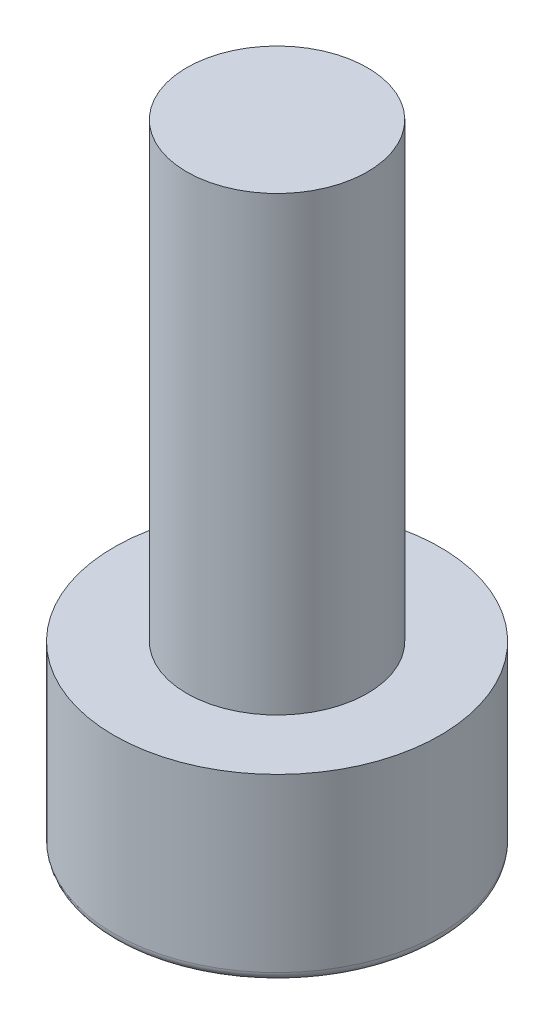
ISO-10303-21;
HEADER;
FILE_DESCRIPTION(('STEP AP214'),'2;1');
FILE_NAME('part.step','',(''),(''),'','','');
FILE_SCHEMA(('AUTOMOTIVE_DESIGN { 1 0 10303 214 1 1 1 1 }'));
ENDSEC;
DATA;
#1=APPLICATION_CONTEXT('core data for automotive mechanical design processes');
#2=APPLICATION_PROTOCOL_DEFINITION('international standard','automotive_design',2000,#1);
#3=PRODUCT_CONTEXT('',#1,'mechanical');
#4=PRODUCT('Part','Part','',(#3));
#5=PRODUCT_RELATED_PRODUCT_CATEGORY('part','',(#4));
#6=PRODUCT_DEFINITION_FORMATION('','',#4);
#7=PRODUCT_DEFINITION_CONTEXT('part definition',#1,'design');
#8=PRODUCT_DEFINITION('design','',#6,#7);
#9=PRODUCT_DEFINITION_SHAPE('','',#8);
#10=(LENGTH_UNIT() NAMED_UNIT(*) SI_UNIT(.MILLI.,.METRE.));
#11=(NAMED_UNIT(*) PLANE_ANGLE_UNIT() SI_UNIT($,.RADIAN.));
#12=(NAMED_UNIT(*) SI_UNIT($,.STERADIAN.) SOLID_ANGLE_UNIT());
#13=UNCERTAINTY_MEASURE_WITH_UNIT(LENGTH_MEASURE(1.E-05),#10,'distance_accuracy_value','');
#14=(GEOMETRIC_REPRESENTATION_CONTEXT(3) GLOBAL_UNCERTAINTY_ASSIGNED_CONTEXT((#13)) GLOBAL_UNIT_ASSIGNED_CONTEXT((#10,
#11,#12)) REPRESENTATION_CONTEXT('',''));
#15=CARTESIAN_POINT('',(0.,0.,0.));
#16=DIRECTION('',(0.,0.,1.));
#17=DIRECTION('',(1.,0.,0.));
#18=AXIS2_PLACEMENT_3D('',#15,#16,#17);
#19=CARTESIAN_POINT('',(4.801923715428,74.22799013228,211.8563655581));
#20=DIRECTION('',(0.,-1.,0.));
#21=DIRECTION('',(0.,0.,-1.));
#22=AXIS2_PLACEMENT_3D('',#19,#20,#21);
#23=PLANE('',#22);
#24=DIRECTION('',(0.,0.,-1.));
#25=VECTOR('',#24,1.);
#26=CARTESIAN_POINT('',(1.459131043565,74.22799013228,215.0364269651));
#27=LINE('',#26,#25);
#28=CARTESIAN_POINT('',(1.4591310435794,74.22799013228,213.097676699031));
#29=VERTEX_POINT('',#28);
#30=CARTESIAN_POINT('',(1.45913104356671,74.22799013228,214.841274511996));
#31=VERTEX_POINT('',#30);
#32=EDGE_CURVE('E84',#29,#31,#27,.F.);
#33=ORIENTED_EDGE('',*,*,#32,.F.);
#34=DIRECTION('',(0.866025403784429,0.,-0.500000000000017));
#35=VECTOR('',#34,1.);
#36=CARTESIAN_POINT('',(1.283533048647,74.22799013228,213.1990582487));
#37=LINE('',#36,#35);
#38=CARTESIAN_POINT('',(2.96913104358536,74.22799013228,212.225877792566));
#39=VERTEX_POINT('',#38);
#40=EDGE_CURVE('E68',#39,#29,#37,.F.);
#41=ORIENTED_EDGE('',*,*,#40,.F.);
#42=DIRECTION('',(0.866025403784429,0.,0.500000000000017));
#43=VECTOR('',#42,1.);
#44=CARTESIAN_POINT('',(2.793533048649,74.22799013228,212.1244962429));
#45=LINE('',#44,#43);
#46=CARTESIAN_POINT('',(4.47913104356371,74.22799013228,213.097676699003));
#47=VERTEX_POINT('',#46);
#48=EDGE_CURVE('E73',#47,#39,#45,.F.);
#49=ORIENTED_EDGE('',*,*,#48,.F.);
#50=DIRECTION('',(0.,0.,1.));
#51=VECTOR('',#50,1.);
#52=CARTESIAN_POINT('',(4.479131043565,74.22799013228,212.9025242459));
#53=LINE('',#52,#51);
#54=CARTESIAN_POINT('',(4.47913104357273,74.22799013228,214.841274512019));
#55=VERTEX_POINT('',#54);
#56=EDGE_CURVE('E125',#55,#47,#53,.F.);
#57=ORIENTED_EDGE('',*,*,#56,.F.);
#58=DIRECTION('',(-0.866025403784429,0.,0.500000000000017));
#59=VECTOR('',#58,1.);
#60=CARTESIAN_POINT('',(4.654729038483,74.22799013228,214.7398929624));
#61=LINE('',#60,#59);
#62=CARTESIAN_POINT('',(2.96913104358062,74.22799013228,215.713073418486));
#63=VERTEX_POINT('',#62);
#64=EDGE_CURVE('E128',#63,#55,#61,.F.);
#65=ORIENTED_EDGE('',*,*,#64,.F.);
#66=DIRECTION('',(-0.866025403784429,0.,-0.500000000000017));
#67=VECTOR('',#66,1.);
#68=CARTESIAN_POINT('',(3.144729038485,74.22799013228,215.8144549681));
#69=LINE('',#68,#67);
#70=EDGE_CURVE('E133',#31,#63,#69,.F.);
#71=ORIENTED_EDGE('',*,*,#70,.F.);
#72=EDGE_LOOP('',(#33,#41,#49,#57,#65,#71));
#73=FACE_BOUND('',#72,.T.);
#74=ADVANCED_FACE('F17',(#73),#23,.T.);
#75=CARTESIAN_POINT('',(2.793533048649,74.44878280414,212.1244962429));
#76=DIRECTION('',(-0.500000000000017,0.,0.866025403784429));
#77=DIRECTION('',(0.866025403784429,0.,0.500000000000017));
#78=AXIS2_PLACEMENT_3D('',#75,#76,#77);
#79=PLANE('',#78);
#80=ORIENTED_EDGE('',*,*,#48,.T.);
#81=DIRECTION('',(0.,1.,0.));
#82=VECTOR('',#81,1.);
#83=CARTESIAN_POINT('',(2.96913104358263,74.44878280414,212.225877792578));
#84=LINE('',#83,#82);
#85=CARTESIAN_POINT('',(2.96913104358711,72.22799013228,212.225877792563));
#86=VERTEX_POINT('',#85);
#87=EDGE_CURVE('E75',#86,#39,#84,.T.);
#88=ORIENTED_EDGE('',*,*,#87,.F.);
#89=DIRECTION('',(-0.866025403794045,0.,-0.499999999983361));
#90=VECTOR('',#89,1.);
#91=CARTESIAN_POINT('',(4.47913104356407,72.22799013228,213.097676699002));
#92=LINE('',#91,#90);
#93=CARTESIAN_POINT('',(4.47913104356474,72.22799013228,213.097676699006));
#94=VERTEX_POINT('',#93);
#95=EDGE_CURVE('E122',#94,#86,#92,.T.);
#96=ORIENTED_EDGE('',*,*,#95,.F.);
#97=DIRECTION('',(0.,1.,0.));
#98=VECTOR('',#97,1.);
#99=CARTESIAN_POINT('',(4.479131043565,74.44878280414,213.097676699002));
#100=LINE('',#99,#98);
#101=EDGE_CURVE('E78',#47,#94,#100,.F.);
#102=ORIENTED_EDGE('',*,*,#101,.F.);
#103=EDGE_LOOP('',(#80,#88,#96,#102));
#104=FACE_BOUND('',#103,.T.);
#105=ADVANCED_FACE('F74',(#104),#79,.T.);
#106=CARTESIAN_POINT('',(1.283533048647,74.44878280414,213.1990582487));
#107=DIRECTION('',(0.500000000000017,0.,0.866025403784429));
#108=DIRECTION('',(0.866025403784429,0.,-0.500000000000017));
#109=AXIS2_PLACEMENT_3D('',#106,#107,#108);
#110=PLANE('',#109);
#111=ORIENTED_EDGE('',*,*,#40,.T.);
#112=DIRECTION('',(0.,1.,0.));
#113=VECTOR('',#112,1.);
#114=CARTESIAN_POINT('',(1.459131043565,74.44878280414,213.097676699012));
#115=LINE('',#114,#113);
#116=CARTESIAN_POINT('',(1.45913104358081,72.22799013228,213.09767669903));
#117=VERTEX_POINT('',#116);
#118=EDGE_CURVE('E86',#117,#29,#115,.T.);
#119=ORIENTED_EDGE('',*,*,#118,.F.);
#120=DIRECTION('',(-0.866025403794834,0.,0.499999999981995));
#121=VECTOR('',#120,1.);
#122=CARTESIAN_POINT('',(2.96913104357969,72.22799013228,212.225877792573));
#123=LINE('',#122,#121);
#124=EDGE_CURVE('E90',#86,#117,#123,.T.);
#125=ORIENTED_EDGE('',*,*,#124,.F.);
#126=ORIENTED_EDGE('',*,*,#87,.T.);
#127=EDGE_LOOP('',(#111,#119,#125,#126));
#128=FACE_BOUND('',#127,.T.);
#129=ADVANCED_FACE('F88',(#128),#110,.T.);
#130=CARTESIAN_POINT('',(1.459131043565,74.44878280414,215.0364269651));
#131=DIRECTION('',(1.,0.,0.));
#132=DIRECTION('',(0.,0.,-1.));
#133=AXIS2_PLACEMENT_3D('',#130,#131,#132);
#134=PLANE('',#133);
#135=ORIENTED_EDGE('',*,*,#32,.T.);
#136=DIRECTION('',(0.,1.,0.));
#137=VECTOR('',#136,1.);
#138=CARTESIAN_POINT('',(1.45913104357047,74.44878280414,214.841274511991));
#139=LINE('',#138,#137);
#140=CARTESIAN_POINT('',(1.45913104356812,72.22799013228,214.841274511997));
#141=VERTEX_POINT('',#140);
#142=EDGE_CURVE('E135',#141,#31,#139,.T.);
#143=ORIENTED_EDGE('',*,*,#142,.F.);
#144=DIRECTION('',(0.,0.,-1.));
#145=VECTOR('',#144,1.);
#146=CARTESIAN_POINT('',(1.45913104357203,72.22799013228,218.0822682774));
#147=LINE('',#146,#145);
#148=EDGE_CURVE('E118',#117,#141,#147,.F.);
#149=ORIENTED_EDGE('',*,*,#148,.F.);
#150=ORIENTED_EDGE('',*,*,#118,.T.);
#151=EDGE_LOOP('',(#135,#143,#149,#150));
#152=FACE_BOUND('',#151,.T.);
#153=ADVANCED_FACE('F140',(#152),#134,.T.);
#154=CARTESIAN_POINT('',(3.144729038485,74.44878280414,215.8144549681));
#155=DIRECTION('',(0.500000000000017,0.,-0.866025403784429));
#156=DIRECTION('',(-0.866025403784429,0.,-0.500000000000017));
#157=AXIS2_PLACEMENT_3D('',#154,#155,#156);
#158=PLANE('',#157);
#159=ORIENTED_EDGE('',*,*,#70,.T.);
#160=DIRECTION('',(0.,1.,0.));
#161=VECTOR('',#160,1.);
#162=CARTESIAN_POINT('',(2.96913104358284,74.44878280414,215.713073418501));
#163=LINE('',#162,#161);
#164=CARTESIAN_POINT('',(2.96913104358157,72.22799013228,215.713073418485));
#165=VERTEX_POINT('',#164);
#166=EDGE_CURVE('E130',#165,#63,#163,.T.);
#167=ORIENTED_EDGE('',*,*,#166,.F.);
#168=DIRECTION('',(0.866025403782101,0.,0.500000000004048));
#169=VECTOR('',#168,1.);
#170=CARTESIAN_POINT('',(1.45913104356637,72.22799013228,214.841274511998));
#171=LINE('',#170,#169);
#172=EDGE_CURVE('E115',#141,#165,#171,.T.);
#173=ORIENTED_EDGE('',*,*,#172,.F.);
#174=ORIENTED_EDGE('',*,*,#142,.T.);
#175=EDGE_LOOP('',(#159,#167,#173,#174));
#176=FACE_BOUND('',#175,.T.);
#177=ADVANCED_FACE('F149',(#176),#158,.T.);
#178=CARTESIAN_POINT('',(4.654729038483,74.44878280414,214.7398929624));
#179=DIRECTION('',(-0.500000000000017,0.,-0.866025403784429));
#180=DIRECTION('',(-0.866025403784429,0.,0.500000000000017));
#181=AXIS2_PLACEMENT_3D('',#178,#179,#180);
#182=PLANE('',#181);
#183=ORIENTED_EDGE('',*,*,#64,.T.);
#184=DIRECTION('',(0.,1.,0.));
#185=VECTOR('',#184,1.);
#186=CARTESIAN_POINT('',(4.479131043565,74.44878280414,214.841274512013));
#187=LINE('',#186,#185);
#188=CARTESIAN_POINT('',(4.47913104357474,72.22799013228,214.84127451202));
#189=VERTEX_POINT('',#188);
#190=EDGE_CURVE('E36',#189,#55,#187,.T.);
#191=ORIENTED_EDGE('',*,*,#190,.F.);
#192=DIRECTION('',(0.866025403784169,0.,-0.500000000000467));
#193=VECTOR('',#192,1.);
#194=CARTESIAN_POINT('',(2.96913104357571,72.22799013228,215.713073418489));
#195=LINE('',#194,#193);
#196=EDGE_CURVE('E112',#165,#189,#195,.T.);
#197=ORIENTED_EDGE('',*,*,#196,.F.);
#198=ORIENTED_EDGE('',*,*,#166,.T.);
#199=EDGE_LOOP('',(#183,#191,#197,#198));
#200=FACE_BOUND('',#199,.T.);
#201=ADVANCED_FACE('F147',(#200),#182,.T.);
#202=CARTESIAN_POINT('',(4.479131043565,74.44878280414,212.9025242459));
#203=DIRECTION('',(-1.,0.,0.));
#204=DIRECTION('',(0.,0.,1.));
#205=AXIS2_PLACEMENT_3D('',#202,#203,#204);
#206=PLANE('',#205);
#207=ORIENTED_EDGE('',*,*,#56,.T.);
#208=ORIENTED_EDGE('',*,*,#101,.T.);
#209=DIRECTION('',(0.,0.,-1.));
#210=VECTOR('',#209,1.);
#211=CARTESIAN_POINT('',(4.47913104357259,72.22799013228,218.0822682774));
#212=LINE('',#211,#210);
#213=EDGE_CURVE('E106',#189,#94,#212,.T.);
#214=ORIENTED_EDGE('',*,*,#213,.F.);
#215=ORIENTED_EDGE('',*,*,#190,.T.);
#216=EDGE_LOOP('',(#207,#208,#214,#215));
#217=FACE_BOUND('',#216,.T.);
#218=ADVANCED_FACE('F145',(#217),#206,.T.);
#219=CARTESIAN_POINT('',(-1.143661628294,72.22799013228,218.0822682774));
#220=DIRECTION('',(0.,-1.,0.));
#221=DIRECTION('',(0.,0.,-1.));
#222=AXIS2_PLACEMENT_3D('',#219,#220,#221);
#223=PLANE('',#222);
#224=CARTESIAN_POINT('',(2.969131043567,72.22799013228,213.9694756055));
#225=DIRECTION('',(0.,1.,0.));
#226=DIRECTION('',(0.,0.,1.));
#227=AXIS2_PLACEMENT_3D('',#224,#225,#226);
#228=CIRCLE('',#227,3.41000000000203);
#229=CARTESIAN_POINT('',(2.969131043567,72.2279901322801,217.379475605502));
#230=VERTEX_POINT('',#229);
#231=EDGE_CURVE('E21',#230,#230,#228,.T.);
#232=ORIENTED_EDGE('',*,*,#231,.F.);
#233=EDGE_LOOP('',(#232));
#234=FACE_BOUND('',#233,.T.);
#235=ORIENTED_EDGE('',*,*,#196,.T.);
#236=ORIENTED_EDGE('',*,*,#213,.T.);
#237=ORIENTED_EDGE('',*,*,#95,.T.);
#238=ORIENTED_EDGE('',*,*,#124,.T.);
#239=ORIENTED_EDGE('',*,*,#148,.T.);
#240=ORIENTED_EDGE('',*,*,#172,.T.);
#241=EDGE_LOOP('',(#235,#236,#237,#238,#239,#240));
#242=FACE_BOUND('',#241,.T.);
#243=ADVANCED_FACE('F143',(#234,#242),#223,.T.);
#244=CARTESIAN_POINT('',(2.969131043567,72.42799013228,213.9694756055));
#245=DIRECTION('',(0.,1.,0.));
#246=DIRECTION('',(0.,0.,1.));
#247=AXIS2_PLACEMENT_3D('',#244,#245,#246);
#248=TOROIDAL_SURFACE('',#247,3.41000000000203,0.199999999999987);
#249=ORIENTED_EDGE('',*,*,#231,.T.);
#250=EDGE_LOOP('',(#249));
#251=FACE_BOUND('',#250,.T.);
#252=CARTESIAN_POINT('',(2.969131043567,72.42799013228,213.9694756055));
#253=DIRECTION('',(0.,1.,0.));
#254=DIRECTION('',(0.,0.,1.));
#255=AXIS2_PLACEMENT_3D('',#252,#253,#254);
#256=CIRCLE('',#255,3.61);
#257=CARTESIAN_POINT('',(2.969131043567,72.42799013228,217.5794756055));
#258=VERTEX_POINT('',#257);
#259=EDGE_CURVE('E98',#258,#258,#256,.T.);
#260=ORIENTED_EDGE('',*,*,#259,.F.);
#261=EDGE_LOOP('',(#260));
#262=FACE_BOUND('',#261,.T.);
#263=ADVANCED_FACE('F19',(#251,#262),#248,.T.);
#264=CARTESIAN_POINT('',(2.969131043567,74.32799013228,213.9694756055));
#265=DIRECTION('',(0.,1.,0.));
#266=DIRECTION('',(0.,0.,1.));
#267=AXIS2_PLACEMENT_3D('',#264,#265,#266);
#268=CYLINDRICAL_SURFACE('',#267,3.61);
#269=ORIENTED_EDGE('',*,*,#259,.T.);
#270=EDGE_LOOP('',(#269));
#271=FACE_BOUND('',#270,.T.);
#272=CARTESIAN_POINT('',(2.969131043567,76.22799013228,213.9694756055));
#273=DIRECTION('',(0.,1.,0.));
#274=DIRECTION('',(0.,0.,1.));
#275=AXIS2_PLACEMENT_3D('',#272,#273,#274);
#276=CIRCLE('',#275,3.61);
#277=CARTESIAN_POINT('',(2.969131043567,76.22799013228,217.5794756055));
#278=VERTEX_POINT('',#277);
#279=EDGE_CURVE('E96',#278,#278,#276,.T.);
#280=ORIENTED_EDGE('',*,*,#279,.F.);
#281=EDGE_LOOP('',(#280));
#282=FACE_BOUND('',#281,.T.);
#283=ADVANCED_FACE('F173',(#271,#282),#268,.T.);
#284=CARTESIAN_POINT('',(0.5483383717062,86.22799013228,216.3902682774));
#285=DIRECTION('',(0.,1.,0.));
#286=DIRECTION('',(0.,0.,1.));
#287=AXIS2_PLACEMENT_3D('',#284,#285,#286);
#288=PLANE('',#287);
#289=CARTESIAN_POINT('',(2.969131043567,86.22799013228,213.9694756055));
#290=DIRECTION('',(0.,1.,0.));
#291=DIRECTION('',(0.,0.,1.));
#292=AXIS2_PLACEMENT_3D('',#289,#290,#291);
#293=CIRCLE('',#292,2.);
#294=CARTESIAN_POINT('',(2.969131043567,86.22799013228,215.9694756055));
#295=VERTEX_POINT('',#294);
#296=EDGE_CURVE('E27',#295,#295,#293,.F.);
#297=ORIENTED_EDGE('',*,*,#296,.F.);
#298=EDGE_LOOP('',(#297));
#299=FACE_BOUND('',#298,.T.);
#300=ADVANCED_FACE('F167',(#299),#288,.T.);
#301=CARTESIAN_POINT('',(-1.383661628294,76.22799013228,218.3222682774));
#302=DIRECTION('',(0.,1.,0.));
#303=DIRECTION('',(0.,0.,1.));
#304=AXIS2_PLACEMENT_3D('',#301,#302,#303);
#305=PLANE('',#304);
#306=ORIENTED_EDGE('',*,*,#279,.T.);
#307=EDGE_LOOP('',(#306));
#308=FACE_BOUND('',#307,.T.);
#309=CARTESIAN_POINT('',(2.969131043567,76.22799013228,213.9694756055));
#310=DIRECTION('',(0.,1.,0.));
#311=DIRECTION('',(0.,0.,1.));
#312=AXIS2_PLACEMENT_3D('',#309,#310,#311);
#313=CIRCLE('',#312,2.);
#314=CARTESIAN_POINT('',(2.969131043567,76.22799013228,215.9694756055));
#315=VERTEX_POINT('',#314);
#316=EDGE_CURVE('E11',#315,#315,#313,.T.);
#317=ORIENTED_EDGE('',*,*,#316,.F.);
#318=EDGE_LOOP('',(#317));
#319=FACE_BOUND('',#318,.T.);
#320=ADVANCED_FACE('F161',(#308,#319),#305,.T.);
#321=CARTESIAN_POINT('',(2.969131043567,81.22799013228,213.9694756055));
#322=DIRECTION('',(0.,1.,0.));
#323=DIRECTION('',(0.,0.,1.));
#324=AXIS2_PLACEMENT_3D('',#321,#322,#323);
#325=CYLINDRICAL_SURFACE('',#324,2.);
#326=ORIENTED_EDGE('',*,*,#316,.T.);
#327=EDGE_LOOP('',(#326));
#328=FACE_BOUND('',#327,.T.);
#329=ORIENTED_EDGE('',*,*,#296,.T.);
#330=EDGE_LOOP('',(#329));
#331=FACE_BOUND('',#330,.T.);
#332=ADVANCED_FACE('F159',(#328,#331),#325,.T.);
#333=CLOSED_SHELL('',(#74,#105,#129,#153,#177,#201,#218,#243,#263,#283,#300,#320,#332));
#334=MANIFOLD_SOLID_BREP('B1',#333);
#335=ADVANCED_BREP_SHAPE_REPRESENTATION('',(#18,#334),#14);
#336=SHAPE_DEFINITION_REPRESENTATION(#9,#335);
ENDSEC;
END-ISO-10303-21;
